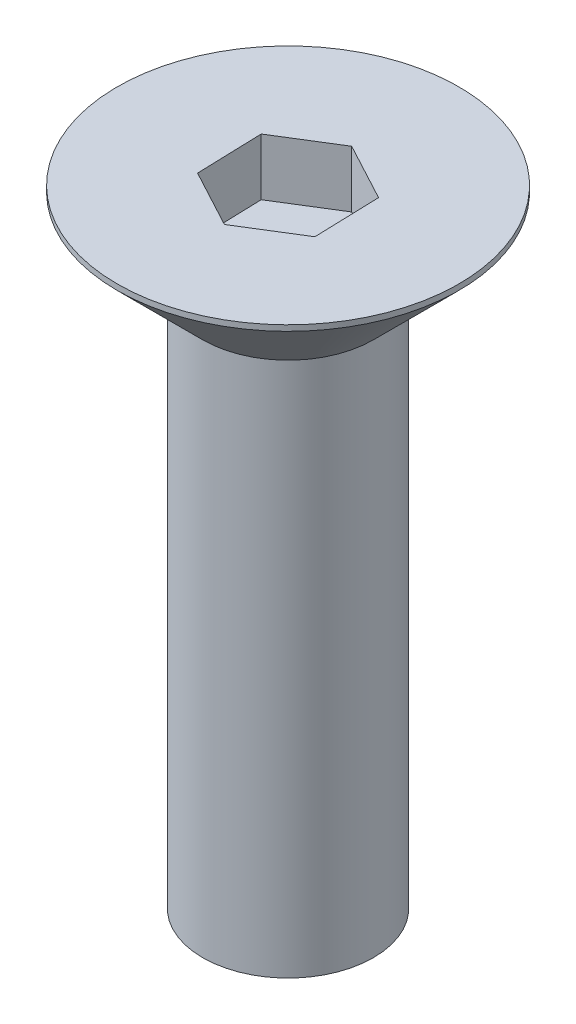
ISO-10303-21;
HEADER;
FILE_DESCRIPTION(('STEP AP214'),'2;1');
FILE_NAME('part.step','',(''),(''),'','','');
FILE_SCHEMA(('AUTOMOTIVE_DESIGN { 1 0 10303 214 1 1 1 1 }'));
ENDSEC;
DATA;
#1=APPLICATION_CONTEXT('core data for automotive mechanical design processes');
#2=APPLICATION_PROTOCOL_DEFINITION('international standard','automotive_design',2000,#1);
#3=PRODUCT_CONTEXT('',#1,'mechanical');
#4=PRODUCT('Part','Part','',(#3));
#5=PRODUCT_RELATED_PRODUCT_CATEGORY('part','',(#4));
#6=PRODUCT_DEFINITION_FORMATION('','',#4);
#7=PRODUCT_DEFINITION_CONTEXT('part definition',#1,'design');
#8=PRODUCT_DEFINITION('design','',#6,#7);
#9=PRODUCT_DEFINITION_SHAPE('','',#8);
#10=(LENGTH_UNIT() NAMED_UNIT(*) SI_UNIT(.MILLI.,.METRE.));
#11=(NAMED_UNIT(*) PLANE_ANGLE_UNIT() SI_UNIT($,.RADIAN.));
#12=(NAMED_UNIT(*) SI_UNIT($,.STERADIAN.) SOLID_ANGLE_UNIT());
#13=UNCERTAINTY_MEASURE_WITH_UNIT(LENGTH_MEASURE(1.E-05),#10,'distance_accuracy_value','');
#14=(GEOMETRIC_REPRESENTATION_CONTEXT(3) GLOBAL_UNCERTAINTY_ASSIGNED_CONTEXT((#13)) GLOBAL_UNIT_ASSIGNED_CONTEXT((#10,
#11,#12)) REPRESENTATION_CONTEXT('',''));
#15=CARTESIAN_POINT('',(0.,0.,0.));
#16=DIRECTION('',(0.,0.,1.));
#17=DIRECTION('',(1.,0.,0.));
#18=AXIS2_PLACEMENT_3D('',#15,#16,#17);
#19=CARTESIAN_POINT('',(0.,8.,0.));
#20=DIRECTION('',(0.,-1.,0.));
#21=DIRECTION('',(0.,0.,-1.));
#22=AXIS2_PLACEMENT_3D('',#19,#20,#21);
#23=CYLINDRICAL_SURFACE('',#22,1.5);
#24=CARTESIAN_POINT('',(0.,9.40000000000004,0.));
#25=DIRECTION('',(0.,1.,0.));
#26=DIRECTION('',(0.,0.,1.));
#27=AXIS2_PLACEMENT_3D('',#24,#25,#26);
#28=CIRCLE('',#27,1.5);
#29=CARTESIAN_POINT('',(0.,9.40000000000004,1.5));
#30=VERTEX_POINT('',#29);
#31=EDGE_CURVE('E11',#30,#30,#28,.F.);
#32=ORIENTED_EDGE('',*,*,#31,.T.);
#33=EDGE_LOOP('',(#32));
#34=FACE_BOUND('',#33,.T.);
#35=CARTESIAN_POINT('',(0.,0.,0.));
#36=DIRECTION('',(0.,1.,0.));
#37=DIRECTION('',(0.,0.,1.));
#38=AXIS2_PLACEMENT_3D('',#35,#36,#37);
#39=CIRCLE('',#38,1.5);
#40=CARTESIAN_POINT('',(0.,0.,1.5));
#41=VERTEX_POINT('',#40);
#42=EDGE_CURVE('E145',#41,#41,#39,.T.);
#43=ORIENTED_EDGE('',*,*,#42,.T.);
#44=EDGE_LOOP('',(#43));
#45=FACE_BOUND('',#44,.T.);
#46=ADVANCED_FACE('F35',(#34,#45),#23,.T.);
#47=CARTESIAN_POINT('',(0.,0.,0.));
#48=DIRECTION('',(0.,1.,0.));
#49=DIRECTION('',(0.,0.,1.));
#50=AXIS2_PLACEMENT_3D('',#47,#48,#49);
#51=PLANE('',#50);
#52=ORIENTED_EDGE('',*,*,#42,.F.);
#53=EDGE_LOOP('',(#52));
#54=FACE_BOUND('',#53,.T.);
#55=ADVANCED_FACE('F167',(#54),#51,.F.);
#56=CARTESIAN_POINT('',(0.,11.,0.));
#57=DIRECTION('',(0.,-1.,0.));
#58=DIRECTION('',(0.,0.,-1.));
#59=AXIS2_PLACEMENT_3D('',#56,#57,#58);
#60=CYLINDRICAL_SURFACE('',#59,3.);
#61=CARTESIAN_POINT('',(0.,10.9,0.));
#62=DIRECTION('',(0.,1.,0.));
#63=DIRECTION('',(0.,0.,1.));
#64=AXIS2_PLACEMENT_3D('',#61,#62,#63);
#65=CIRCLE('',#64,3.);
#66=CARTESIAN_POINT('',(0.,10.9,3.));
#67=VERTEX_POINT('',#66);
#68=EDGE_CURVE('E43',#67,#67,#65,.T.);
#69=ORIENTED_EDGE('',*,*,#68,.T.);
#70=EDGE_LOOP('',(#69));
#71=FACE_BOUND('',#70,.T.);
#72=CARTESIAN_POINT('',(0.,11.,0.));
#73=DIRECTION('',(0.,1.,0.));
#74=DIRECTION('',(0.,0.,1.));
#75=AXIS2_PLACEMENT_3D('',#72,#73,#74);
#76=CIRCLE('',#75,3.);
#77=CARTESIAN_POINT('',(0.,11.,3.));
#78=VERTEX_POINT('',#77);
#79=EDGE_CURVE('E137',#78,#78,#76,.T.);
#80=ORIENTED_EDGE('',*,*,#79,.F.);
#81=EDGE_LOOP('',(#80));
#82=FACE_BOUND('',#81,.T.);
#83=ADVANCED_FACE('F150',(#71,#82),#60,.T.);
#84=CARTESIAN_POINT('',(0.,11.,0.));
#85=DIRECTION('',(0.,1.,0.));
#86=DIRECTION('',(0.,0.,1.));
#87=AXIS2_PLACEMENT_3D('',#84,#85,#86);
#88=PLANE('',#87);
#89=DIRECTION('',(0.850000320742484,0.,-0.526782170102287));
#90=VECTOR('',#89,1.);
#91=CARTESIAN_POINT('',(0.0360342561103451,11.,1.15413814845533));
#92=LINE('',#91,#90);
#93=CARTESIAN_POINT('',(0.0360342561103451,11.,1.15413814845533));
#94=VERTEX_POINT('',#93);
#95=CARTESIAN_POINT('',(1.01753008409423,11.,0.545862493029633));
#96=VERTEX_POINT('',#95);
#97=EDGE_CURVE('E50',#94,#96,#92,.T.);
#98=ORIENTED_EDGE('',*,*,#97,.F.);
#99=DIRECTION('',(0.881206901940518,0.,0.472730785936769));
#100=VECTOR('',#99,1.);
#101=CARTESIAN_POINT('',(-0.981495827983883,11.,0.608275655425701));
#102=LINE('',#101,#100);
#103=CARTESIAN_POINT('',(-0.981495827983883,11.,0.608275655425701));
#104=VERTEX_POINT('',#103);
#105=EDGE_CURVE('E133',#104,#94,#102,.T.);
#106=ORIENTED_EDGE('',*,*,#105,.F.);
#107=DIRECTION('',(0.0312065811980338,0.,0.999512956039055));
#108=VECTOR('',#107,1.);
#109=CARTESIAN_POINT('',(-1.01753008409423,11.,-0.545862493029634));
#110=LINE('',#109,#108);
#111=CARTESIAN_POINT('',(-1.01753008409423,11.,-0.545862493029634));
#112=VERTEX_POINT('',#111);
#113=EDGE_CURVE('E131',#112,#104,#110,.T.);
#114=ORIENTED_EDGE('',*,*,#113,.F.);
#115=DIRECTION('',(-0.850000320742484,0.,0.526782170102287));
#116=VECTOR('',#115,1.);
#117=CARTESIAN_POINT('',(-0.0360342561103455,11.,-1.15413814845534));
#118=LINE('',#117,#116);
#119=CARTESIAN_POINT('',(-0.0360342561103455,11.,-1.15413814845534));
#120=VERTEX_POINT('',#119);
#121=EDGE_CURVE('E98',#120,#112,#118,.T.);
#122=ORIENTED_EDGE('',*,*,#121,.F.);
#123=DIRECTION('',(-0.881206901940518,0.,-0.472730785936769));
#124=VECTOR('',#123,1.);
#125=CARTESIAN_POINT('',(0.981495827983882,11.,-0.608275655425702));
#126=LINE('',#125,#124);
#127=CARTESIAN_POINT('',(0.981495827983882,11.,-0.608275655425702));
#128=VERTEX_POINT('',#127);
#129=EDGE_CURVE('E127',#128,#120,#126,.T.);
#130=ORIENTED_EDGE('',*,*,#129,.F.);
#131=DIRECTION('',(-0.0312065811980342,0.,-0.999512956039055));
#132=VECTOR('',#131,1.);
#133=CARTESIAN_POINT('',(1.01753008409423,11.,0.545862493029633));
#134=LINE('',#133,#132);
#135=EDGE_CURVE('E124',#96,#128,#134,.T.);
#136=ORIENTED_EDGE('',*,*,#135,.F.);
#137=EDGE_LOOP('',(#98,#106,#114,#122,#130,#136));
#138=FACE_BOUND('',#137,.T.);
#139=ORIENTED_EDGE('',*,*,#79,.T.);
#140=EDGE_LOOP('',(#139));
#141=FACE_BOUND('',#140,.T.);
#142=ADVANCED_FACE('F155',(#138,#141),#88,.T.);
#143=CARTESIAN_POINT('',(0.,10.9,0.));
#144=DIRECTION('',(0.,1.,0.));
#145=DIRECTION('',(0.,0.,1.));
#146=AXIS2_PLACEMENT_3D('',#143,#144,#145);
#147=CONICAL_SURFACE('',#146,3.,0.785398163397453);
#148=ORIENTED_EDGE('',*,*,#31,.F.);
#149=EDGE_LOOP('',(#148));
#150=FACE_BOUND('',#149,.T.);
#151=ORIENTED_EDGE('',*,*,#68,.F.);
#152=EDGE_LOOP('',(#151));
#153=FACE_BOUND('',#152,.T.);
#154=ADVANCED_FACE('F37',(#150,#153),#147,.T.);
#155=CARTESIAN_POINT('',(0.0360342561103451,10.,1.15413814845533));
#156=DIRECTION('',(0.526782170102287,0.,0.850000320742484));
#157=DIRECTION('',(0.850000320742484,0.,-0.526782170102287));
#158=AXIS2_PLACEMENT_3D('',#155,#156,#157);
#159=PLANE('',#158);
#160=ORIENTED_EDGE('',*,*,#97,.T.);
#161=DIRECTION('',(0.,1.,0.));
#162=VECTOR('',#161,1.);
#163=CARTESIAN_POINT('',(1.01753008409423,10.,0.545862493029633));
#164=LINE('',#163,#162);
#165=CARTESIAN_POINT('',(1.01753008409423,10.,0.545862493029633));
#166=VERTEX_POINT('',#165);
#167=EDGE_CURVE('E80',#166,#96,#164,.T.);
#168=ORIENTED_EDGE('',*,*,#167,.F.);
#169=DIRECTION('',(0.850000320742484,0.,-0.526782170102287));
#170=VECTOR('',#169,1.);
#171=CARTESIAN_POINT('',(0.0360342561103451,10.,1.15413814845533));
#172=LINE('',#171,#170);
#173=CARTESIAN_POINT('',(0.0360342561103451,10.,1.15413814845533));
#174=VERTEX_POINT('',#173);
#175=EDGE_CURVE('E135',#174,#166,#172,.T.);
#176=ORIENTED_EDGE('',*,*,#175,.F.);
#177=DIRECTION('',(0.,1.,0.));
#178=VECTOR('',#177,1.);
#179=CARTESIAN_POINT('',(0.0360342561103451,10.,1.15413814845533));
#180=LINE('',#179,#178);
#181=EDGE_CURVE('E58',#174,#94,#180,.T.);
#182=ORIENTED_EDGE('',*,*,#181,.T.);
#183=EDGE_LOOP('',(#160,#168,#176,#182));
#184=FACE_BOUND('',#183,.T.);
#185=ADVANCED_FACE('F154',(#184),#159,.F.);
#186=CARTESIAN_POINT('',(-0.981495827983883,10.,0.608275655425701));
#187=DIRECTION('',(-0.472730785936769,0.,0.881206901940518));
#188=DIRECTION('',(0.881206901940518,0.,0.472730785936769));
#189=AXIS2_PLACEMENT_3D('',#186,#187,#188);
#190=PLANE('',#189);
#191=ORIENTED_EDGE('',*,*,#105,.T.);
#192=ORIENTED_EDGE('',*,*,#181,.F.);
#193=DIRECTION('',(0.881206901940518,0.,0.472730785936769));
#194=VECTOR('',#193,1.);
#195=CARTESIAN_POINT('',(-0.981495827983883,10.,0.608275655425701));
#196=LINE('',#195,#194);
#197=CARTESIAN_POINT('',(-0.981495827983883,10.,0.608275655425701));
#198=VERTEX_POINT('',#197);
#199=EDGE_CURVE('E110',#198,#174,#196,.T.);
#200=ORIENTED_EDGE('',*,*,#199,.F.);
#201=DIRECTION('',(0.,1.,0.));
#202=VECTOR('',#201,1.);
#203=CARTESIAN_POINT('',(-0.981495827983883,10.,0.608275655425701));
#204=LINE('',#203,#202);
#205=EDGE_CURVE('E102',#198,#104,#204,.T.);
#206=ORIENTED_EDGE('',*,*,#205,.T.);
#207=EDGE_LOOP('',(#191,#192,#200,#206));
#208=FACE_BOUND('',#207,.T.);
#209=ADVANCED_FACE('F161',(#208),#190,.F.);
#210=CARTESIAN_POINT('',(-1.01753008409423,10.,-0.545862493029634));
#211=DIRECTION('',(-0.999512956039055,0.,0.0312065811980338));
#212=DIRECTION('',(0.0312065811980338,0.,0.999512956039055));
#213=AXIS2_PLACEMENT_3D('',#210,#211,#212);
#214=PLANE('',#213);
#215=ORIENTED_EDGE('',*,*,#113,.T.);
#216=ORIENTED_EDGE('',*,*,#205,.F.);
#217=DIRECTION('',(0.0312065811980338,0.,0.999512956039055));
#218=VECTOR('',#217,1.);
#219=CARTESIAN_POINT('',(-1.01753008409423,10.,-0.545862493029634));
#220=LINE('',#219,#218);
#221=CARTESIAN_POINT('',(-1.01753008409423,10.,-0.545862493029634));
#222=VERTEX_POINT('',#221);
#223=EDGE_CURVE('E106',#222,#198,#220,.T.);
#224=ORIENTED_EDGE('',*,*,#223,.F.);
#225=DIRECTION('',(0.,1.,0.));
#226=VECTOR('',#225,1.);
#227=CARTESIAN_POINT('',(-1.01753008409423,10.,-0.545862493029634));
#228=LINE('',#227,#226);
#229=EDGE_CURVE('E91',#222,#112,#228,.T.);
#230=ORIENTED_EDGE('',*,*,#229,.T.);
#231=EDGE_LOOP('',(#215,#216,#224,#230));
#232=FACE_BOUND('',#231,.T.);
#233=ADVANCED_FACE('F107',(#232),#214,.F.);
#234=CARTESIAN_POINT('',(-0.0360342561103455,10.,-1.15413814845534));
#235=DIRECTION('',(-0.526782170102287,0.,-0.850000320742484));
#236=DIRECTION('',(-0.850000320742484,0.,0.526782170102287));
#237=AXIS2_PLACEMENT_3D('',#234,#235,#236);
#238=PLANE('',#237);
#239=ORIENTED_EDGE('',*,*,#121,.T.);
#240=ORIENTED_EDGE('',*,*,#229,.F.);
#241=DIRECTION('',(-0.850000320742484,0.,0.526782170102287));
#242=VECTOR('',#241,1.);
#243=CARTESIAN_POINT('',(-0.0360342561103455,10.,-1.15413814845534));
#244=LINE('',#243,#242);
#245=CARTESIAN_POINT('',(-0.0360342561103455,10.,-1.15413814845534));
#246=VERTEX_POINT('',#245);
#247=EDGE_CURVE('E95',#246,#222,#244,.T.);
#248=ORIENTED_EDGE('',*,*,#247,.F.);
#249=DIRECTION('',(0.,1.,0.));
#250=VECTOR('',#249,1.);
#251=CARTESIAN_POINT('',(-0.0360342561103455,10.,-1.15413814845534));
#252=LINE('',#251,#250);
#253=EDGE_CURVE('E103',#246,#120,#252,.T.);
#254=ORIENTED_EDGE('',*,*,#253,.T.);
#255=EDGE_LOOP('',(#239,#240,#248,#254));
#256=FACE_BOUND('',#255,.T.);
#257=ADVANCED_FACE('F93',(#256),#238,.F.);
#258=CARTESIAN_POINT('',(0.981495827983882,10.,-0.608275655425702));
#259=DIRECTION('',(0.472730785936769,0.,-0.881206901940518));
#260=DIRECTION('',(-0.881206901940518,0.,-0.472730785936769));
#261=AXIS2_PLACEMENT_3D('',#258,#259,#260);
#262=PLANE('',#261);
#263=ORIENTED_EDGE('',*,*,#129,.T.);
#264=ORIENTED_EDGE('',*,*,#253,.F.);
#265=DIRECTION('',(-0.881206901940518,0.,-0.472730785936769));
#266=VECTOR('',#265,1.);
#267=CARTESIAN_POINT('',(0.981495827983882,10.,-0.608275655425702));
#268=LINE('',#267,#266);
#269=CARTESIAN_POINT('',(0.981495827983882,10.,-0.608275655425702));
#270=VERTEX_POINT('',#269);
#271=EDGE_CURVE('E116',#270,#246,#268,.T.);
#272=ORIENTED_EDGE('',*,*,#271,.F.);
#273=DIRECTION('',(0.,1.,0.));
#274=VECTOR('',#273,1.);
#275=CARTESIAN_POINT('',(0.981495827983882,10.,-0.608275655425702));
#276=LINE('',#275,#274);
#277=EDGE_CURVE('E140',#270,#128,#276,.T.);
#278=ORIENTED_EDGE('',*,*,#277,.T.);
#279=EDGE_LOOP('',(#263,#264,#272,#278));
#280=FACE_BOUND('',#279,.T.);
#281=ADVANCED_FACE('F181',(#280),#262,.F.);
#282=CARTESIAN_POINT('',(1.01753008409423,10.,0.545862493029633));
#283=DIRECTION('',(0.999512956039055,0.,-0.0312065811980342));
#284=DIRECTION('',(-0.0312065811980342,0.,-0.999512956039055));
#285=AXIS2_PLACEMENT_3D('',#282,#283,#284);
#286=PLANE('',#285);
#287=ORIENTED_EDGE('',*,*,#135,.T.);
#288=ORIENTED_EDGE('',*,*,#277,.F.);
#289=DIRECTION('',(-0.0312065811980342,0.,-0.999512956039055));
#290=VECTOR('',#289,1.);
#291=CARTESIAN_POINT('',(1.01753008409423,10.,0.545862493029633));
#292=LINE('',#291,#290);
#293=EDGE_CURVE('E118',#166,#270,#292,.T.);
#294=ORIENTED_EDGE('',*,*,#293,.F.);
#295=ORIENTED_EDGE('',*,*,#167,.T.);
#296=EDGE_LOOP('',(#287,#288,#294,#295));
#297=FACE_BOUND('',#296,.T.);
#298=ADVANCED_FACE('F178',(#297),#286,.F.);
#299=CARTESIAN_POINT('',(0.,10.,0.));
#300=DIRECTION('',(0.,1.,0.));
#301=DIRECTION('',(0.,0.,1.));
#302=AXIS2_PLACEMENT_3D('',#299,#300,#301);
#303=PLANE('',#302);
#304=ORIENTED_EDGE('',*,*,#175,.T.);
#305=ORIENTED_EDGE('',*,*,#293,.T.);
#306=ORIENTED_EDGE('',*,*,#271,.T.);
#307=ORIENTED_EDGE('',*,*,#247,.T.);
#308=ORIENTED_EDGE('',*,*,#223,.T.);
#309=ORIENTED_EDGE('',*,*,#199,.T.);
#310=EDGE_LOOP('',(#304,#305,#306,#307,#308,#309));
#311=FACE_BOUND('',#310,.T.);
#312=ADVANCED_FACE('F113',(#311),#303,.T.);
#313=CLOSED_SHELL('',(#46,#55,#83,#142,#154,#185,#209,#233,#257,#281,#298,#312));
#314=MANIFOLD_SOLID_BREP('B2',#313);
#315=ADVANCED_BREP_SHAPE_REPRESENTATION('',(#18,#314),#14);
#316=SHAPE_DEFINITION_REPRESENTATION(#9,#315);
ENDSEC;
END-ISO-10303-21;
